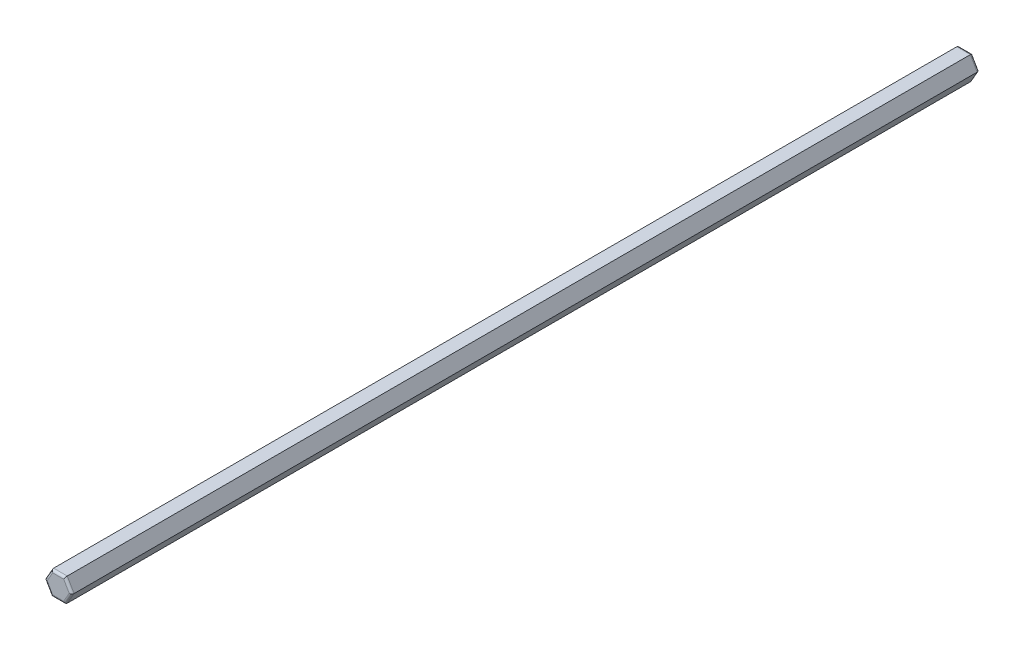
ISO-10303-21;
HEADER;
FILE_DESCRIPTION(('STEP AP214'),'2;1');
FILE_NAME('part.step','',(''),(''),'','','');
FILE_SCHEMA(('AUTOMOTIVE_DESIGN { 1 0 10303 214 1 1 1 1 }'));
ENDSEC;
DATA;
#1=APPLICATION_CONTEXT('core data for automotive mechanical design processes');
#2=APPLICATION_PROTOCOL_DEFINITION('international standard','automotive_design',2000,#1);
#3=PRODUCT_CONTEXT('',#1,'mechanical');
#4=PRODUCT('Part','Part','',(#3));
#5=PRODUCT_RELATED_PRODUCT_CATEGORY('part','',(#4));
#6=PRODUCT_DEFINITION_FORMATION('','',#4);
#7=PRODUCT_DEFINITION_CONTEXT('part definition',#1,'design');
#8=PRODUCT_DEFINITION('design','',#6,#7);
#9=PRODUCT_DEFINITION_SHAPE('','',#8);
#10=(LENGTH_UNIT() NAMED_UNIT(*) SI_UNIT(.MILLI.,.METRE.));
#11=(NAMED_UNIT(*) PLANE_ANGLE_UNIT() SI_UNIT($,.RADIAN.));
#12=(NAMED_UNIT(*) SI_UNIT($,.STERADIAN.) SOLID_ANGLE_UNIT());
#13=UNCERTAINTY_MEASURE_WITH_UNIT(LENGTH_MEASURE(1.E-05),#10,'distance_accuracy_value','');
#14=(GEOMETRIC_REPRESENTATION_CONTEXT(3) GLOBAL_UNCERTAINTY_ASSIGNED_CONTEXT((#13)) GLOBAL_UNIT_ASSIGNED_CONTEXT((#10,
#11,#12)) REPRESENTATION_CONTEXT('',''));
#15=CARTESIAN_POINT('',(0.,0.,0.));
#16=DIRECTION('',(0.,0.,1.));
#17=DIRECTION('',(1.,0.,0.));
#18=AXIS2_PLACEMENT_3D('',#15,#16,#17);
#19=CARTESIAN_POINT('',(0.75,-1.29903810567666,0.));
#20=DIRECTION('',(0.,-1.,0.));
#21=DIRECTION('',(0.,0.,-1.));
#22=AXIS2_PLACEMENT_3D('',#19,#20,#21);
#23=PLANE('',#22);
#24=DIRECTION('',(0.,0.,-1.));
#25=VECTOR('',#24,1.);
#26=CARTESIAN_POINT('',(0.75,-1.29903810567666,0.));
#27=LINE('',#26,#25);
#28=CARTESIAN_POINT('',(0.75,-1.29903810567666,-0.25));
#29=VERTEX_POINT('',#28);
#30=CARTESIAN_POINT('',(0.75,-1.29903810567666,-99.75));
#31=VERTEX_POINT('',#30);
#32=EDGE_CURVE('E133',#29,#31,#27,.T.);
#33=ORIENTED_EDGE('',*,*,#32,.F.);
#34=DIRECTION('',(-1.,0.,0.));
#35=VECTOR('',#34,1.);
#36=CARTESIAN_POINT('',(-0.75,-1.29903810567666,-0.25));
#37=LINE('',#36,#35);
#38=CARTESIAN_POINT('',(-0.749999999999999,-1.29903810567666,-0.25));
#39=VERTEX_POINT('',#38);
#40=EDGE_CURVE('E128',#29,#39,#37,.T.);
#41=ORIENTED_EDGE('',*,*,#40,.T.);
#42=DIRECTION('',(0.,0.,-1.));
#43=VECTOR('',#42,1.);
#44=CARTESIAN_POINT('',(-0.749999999999999,-1.29903810567666,0.));
#45=LINE('',#44,#43);
#46=CARTESIAN_POINT('',(-0.749999999999999,-1.29903810567666,-99.75));
#47=VERTEX_POINT('',#46);
#48=EDGE_CURVE('E130',#39,#47,#45,.T.);
#49=ORIENTED_EDGE('',*,*,#48,.T.);
#50=DIRECTION('',(-1.,0.,0.));
#51=VECTOR('',#50,1.);
#52=CARTESIAN_POINT('',(0.75,-1.29903810567666,-99.75));
#53=LINE('',#52,#51);
#54=EDGE_CURVE('E139',#47,#31,#53,.F.);
#55=ORIENTED_EDGE('',*,*,#54,.T.);
#56=EDGE_LOOP('',(#33,#41,#49,#55));
#57=FACE_BOUND('',#56,.T.);
#58=ADVANCED_FACE('F34',(#57),#23,.T.);
#59=CARTESIAN_POINT('',(1.5,0.,0.));
#60=DIRECTION('',(0.866025403784439,-0.5,0.));
#61=DIRECTION('',(0.5,0.866025403784439,0.));
#62=AXIS2_PLACEMENT_3D('',#59,#60,#61);
#63=PLANE('',#62);
#64=DIRECTION('',(0.,0.,-1.));
#65=VECTOR('',#64,1.);
#66=CARTESIAN_POINT('',(1.5,0.,0.));
#67=LINE('',#66,#65);
#68=CARTESIAN_POINT('',(1.5,0.,-0.25));
#69=VERTEX_POINT('',#68);
#70=CARTESIAN_POINT('',(1.5,0.,-99.75));
#71=VERTEX_POINT('',#70);
#72=EDGE_CURVE('E245',#69,#71,#67,.T.);
#73=ORIENTED_EDGE('',*,*,#72,.F.);
#74=DIRECTION('',(-0.5,-0.866025403784439,0.));
#75=VECTOR('',#74,1.);
#76=CARTESIAN_POINT('',(0.75,-1.29903810567666,-0.25));
#77=LINE('',#76,#75);
#78=EDGE_CURVE('E190',#69,#29,#77,.T.);
#79=ORIENTED_EDGE('',*,*,#78,.T.);
#80=ORIENTED_EDGE('',*,*,#32,.T.);
#81=DIRECTION('',(-0.5,-0.866025403784439,0.));
#82=VECTOR('',#81,1.);
#83=CARTESIAN_POINT('',(1.5,0.,-99.75));
#84=LINE('',#83,#82);
#85=EDGE_CURVE('E188',#31,#71,#84,.F.);
#86=ORIENTED_EDGE('',*,*,#85,.T.);
#87=EDGE_LOOP('',(#73,#79,#80,#86));
#88=FACE_BOUND('',#87,.T.);
#89=ADVANCED_FACE('F242',(#88),#63,.T.);
#90=CARTESIAN_POINT('',(0.749999999999999,1.29903810567666,0.));
#91=DIRECTION('',(0.866025403784439,0.5,0.));
#92=DIRECTION('',(-0.5,0.866025403784439,0.));
#93=AXIS2_PLACEMENT_3D('',#90,#91,#92);
#94=PLANE('',#93);
#95=DIRECTION('',(0.,0.,-1.));
#96=VECTOR('',#95,1.);
#97=CARTESIAN_POINT('',(0.749999999999999,1.29903810567666,0.));
#98=LINE('',#97,#96);
#99=CARTESIAN_POINT('',(0.749999999999999,1.29903810567666,-0.25));
#100=VERTEX_POINT('',#99);
#101=CARTESIAN_POINT('',(0.749999999999999,1.29903810567666,-99.75));
#102=VERTEX_POINT('',#101);
#103=EDGE_CURVE('E247',#100,#102,#98,.T.);
#104=ORIENTED_EDGE('',*,*,#103,.F.);
#105=DIRECTION('',(0.5,-0.866025403784439,0.));
#106=VECTOR('',#105,1.);
#107=CARTESIAN_POINT('',(1.5,0.,-0.25));
#108=LINE('',#107,#106);
#109=EDGE_CURVE('E195',#100,#69,#108,.T.);
#110=ORIENTED_EDGE('',*,*,#109,.T.);
#111=ORIENTED_EDGE('',*,*,#72,.T.);
#112=DIRECTION('',(0.5,-0.866025403784439,0.));
#113=VECTOR('',#112,1.);
#114=CARTESIAN_POINT('',(0.749999999999999,1.29903810567666,-99.75));
#115=LINE('',#114,#113);
#116=EDGE_CURVE('E192',#71,#102,#115,.F.);
#117=ORIENTED_EDGE('',*,*,#116,.T.);
#118=EDGE_LOOP('',(#104,#110,#111,#117));
#119=FACE_BOUND('',#118,.T.);
#120=ADVANCED_FACE('F280',(#119),#94,.T.);
#121=CARTESIAN_POINT('',(-0.75,1.29903810567666,0.));
#122=DIRECTION('',(0.,1.,0.));
#123=DIRECTION('',(0.,0.,1.));
#124=AXIS2_PLACEMENT_3D('',#121,#122,#123);
#125=PLANE('',#124);
#126=DIRECTION('',(0.,0.,-1.));
#127=VECTOR('',#126,1.);
#128=CARTESIAN_POINT('',(-0.75,1.29903810567666,0.));
#129=LINE('',#128,#127);
#130=CARTESIAN_POINT('',(-0.75,1.29903810567666,-0.25));
#131=VERTEX_POINT('',#130);
#132=CARTESIAN_POINT('',(-0.75,1.29903810567666,-99.75));
#133=VERTEX_POINT('',#132);
#134=EDGE_CURVE('E252',#131,#133,#129,.T.);
#135=ORIENTED_EDGE('',*,*,#134,.F.);
#136=DIRECTION('',(1.,0.,0.));
#137=VECTOR('',#136,1.);
#138=CARTESIAN_POINT('',(0.749999999999999,1.29903810567666,-0.25));
#139=LINE('',#138,#137);
#140=EDGE_CURVE('E186',#131,#100,#139,.T.);
#141=ORIENTED_EDGE('',*,*,#140,.T.);
#142=ORIENTED_EDGE('',*,*,#103,.T.);
#143=DIRECTION('',(1.,0.,0.));
#144=VECTOR('',#143,1.);
#145=CARTESIAN_POINT('',(-0.75,1.29903810567666,-99.75));
#146=LINE('',#145,#144);
#147=EDGE_CURVE('E138',#102,#133,#146,.F.);
#148=ORIENTED_EDGE('',*,*,#147,.T.);
#149=EDGE_LOOP('',(#135,#141,#142,#148));
#150=FACE_BOUND('',#149,.T.);
#151=ADVANCED_FACE('F260',(#150),#125,.T.);
#152=CARTESIAN_POINT('',(-1.5,0.,0.));
#153=DIRECTION('',(-0.866025403784439,0.5,0.));
#154=DIRECTION('',(-0.5,-0.866025403784439,0.));
#155=AXIS2_PLACEMENT_3D('',#152,#153,#154);
#156=PLANE('',#155);
#157=DIRECTION('',(0.,0.,-1.));
#158=VECTOR('',#157,1.);
#159=CARTESIAN_POINT('',(-1.5,0.,0.));
#160=LINE('',#159,#158);
#161=CARTESIAN_POINT('',(-1.5,0.,-0.25));
#162=VERTEX_POINT('',#161);
#163=CARTESIAN_POINT('',(-1.5,0.,-99.75));
#164=VERTEX_POINT('',#163);
#165=EDGE_CURVE('E150',#162,#164,#160,.T.);
#166=ORIENTED_EDGE('',*,*,#165,.F.);
#167=DIRECTION('',(0.5,0.866025403784439,0.));
#168=VECTOR('',#167,1.);
#169=CARTESIAN_POINT('',(-0.75,1.29903810567666,-0.25));
#170=LINE('',#169,#168);
#171=EDGE_CURVE('E182',#162,#131,#170,.T.);
#172=ORIENTED_EDGE('',*,*,#171,.T.);
#173=ORIENTED_EDGE('',*,*,#134,.T.);
#174=DIRECTION('',(0.5,0.866025403784439,0.));
#175=VECTOR('',#174,1.);
#176=CARTESIAN_POINT('',(-1.5,0.,-99.75));
#177=LINE('',#176,#175);
#178=EDGE_CURVE('E180',#133,#164,#177,.F.);
#179=ORIENTED_EDGE('',*,*,#178,.T.);
#180=EDGE_LOOP('',(#166,#172,#173,#179));
#181=FACE_BOUND('',#180,.T.);
#182=ADVANCED_FACE('F256',(#181),#156,.T.);
#183=CARTESIAN_POINT('',(-0.749999999999999,-1.29903810567666,0.));
#184=DIRECTION('',(-0.866025403784438,-0.5,0.));
#185=DIRECTION('',(0.5,-0.866025403784439,0.));
#186=AXIS2_PLACEMENT_3D('',#183,#184,#185);
#187=PLANE('',#186);
#188=ORIENTED_EDGE('',*,*,#48,.F.);
#189=DIRECTION('',(-0.5,0.866025403784439,0.));
#190=VECTOR('',#189,1.);
#191=CARTESIAN_POINT('',(-1.5,0.,-0.25));
#192=LINE('',#191,#190);
#193=EDGE_CURVE('E146',#39,#162,#192,.T.);
#194=ORIENTED_EDGE('',*,*,#193,.T.);
#195=ORIENTED_EDGE('',*,*,#165,.T.);
#196=DIRECTION('',(-0.5,0.866025403784439,0.));
#197=VECTOR('',#196,1.);
#198=CARTESIAN_POINT('',(-0.749999999999999,-1.29903810567666,-99.75));
#199=LINE('',#198,#197);
#200=EDGE_CURVE('E149',#164,#47,#199,.F.);
#201=ORIENTED_EDGE('',*,*,#200,.T.);
#202=EDGE_LOOP('',(#188,#194,#195,#201));
#203=FACE_BOUND('',#202,.T.);
#204=ADVANCED_FACE('F143',(#203),#187,.T.);
#205=CARTESIAN_POINT('',(0.,0.,0.));
#206=DIRECTION('',(0.,0.,-1.));
#207=DIRECTION('',(-1.,0.,0.));
#208=AXIS2_PLACEMENT_3D('',#205,#206,#207);
#209=PLANE('',#208);
#210=DIRECTION('',(0.5,0.866025403784439,0.));
#211=VECTOR('',#210,1.);
#212=CARTESIAN_POINT('',(-1.28349364905389,-0.124999999999999,0.));
#213=LINE('',#212,#211);
#214=CARTESIAN_POINT('',(-0.605662432702594,1.04903810567666,0.));
#215=VERTEX_POINT('',#214);
#216=CARTESIAN_POINT('',(-1.21132486540519,0.,0.));
#217=VERTEX_POINT('',#216);
#218=EDGE_CURVE('E176',#215,#217,#213,.F.);
#219=ORIENTED_EDGE('',*,*,#218,.T.);
#220=DIRECTION('',(-0.5,0.866025403784439,0.));
#221=VECTOR('',#220,1.);
#222=CARTESIAN_POINT('',(-0.53349364905389,-1.17403810567666,0.));
#223=LINE('',#222,#221);
#224=CARTESIAN_POINT('',(-0.605662432702593,-1.04903810567666,0.));
#225=VERTEX_POINT('',#224);
#226=EDGE_CURVE('E178',#217,#225,#223,.F.);
#227=ORIENTED_EDGE('',*,*,#226,.T.);
#228=DIRECTION('',(-1.,0.,0.));
#229=VECTOR('',#228,1.);
#230=CARTESIAN_POINT('',(0.75,-1.04903810567666,0.));
#231=LINE('',#230,#229);
#232=CARTESIAN_POINT('',(0.605662432702594,-1.04903810567666,0.));
#233=VERTEX_POINT('',#232);
#234=EDGE_CURVE('E156',#225,#233,#231,.F.);
#235=ORIENTED_EDGE('',*,*,#234,.T.);
#236=DIRECTION('',(-0.5,-0.866025403784439,0.));
#237=VECTOR('',#236,1.);
#238=CARTESIAN_POINT('',(1.28349364905389,0.125,0.));
#239=LINE('',#238,#237);
#240=CARTESIAN_POINT('',(1.21132486540519,0.,0.));
#241=VERTEX_POINT('',#240);
#242=EDGE_CURVE('E168',#233,#241,#239,.F.);
#243=ORIENTED_EDGE('',*,*,#242,.T.);
#244=DIRECTION('',(0.5,-0.866025403784439,0.));
#245=VECTOR('',#244,1.);
#246=CARTESIAN_POINT('',(0.533493649053889,1.17403810567666,0.));
#247=LINE('',#246,#245);
#248=CARTESIAN_POINT('',(0.605662432702593,1.04903810567666,0.));
#249=VERTEX_POINT('',#248);
#250=EDGE_CURVE('E166',#241,#249,#247,.F.);
#251=ORIENTED_EDGE('',*,*,#250,.T.);
#252=DIRECTION('',(1.,0.,0.));
#253=VECTOR('',#252,1.);
#254=CARTESIAN_POINT('',(-0.75,1.04903810567666,0.));
#255=LINE('',#254,#253);
#256=EDGE_CURVE('E173',#249,#215,#255,.F.);
#257=ORIENTED_EDGE('',*,*,#256,.T.);
#258=EDGE_LOOP('',(#219,#227,#235,#243,#251,#257));
#259=FACE_BOUND('',#258,.T.);
#260=ADVANCED_FACE('F272',(#259),#209,.F.);
#261=CARTESIAN_POINT('',(0.,0.,-100.));
#262=DIRECTION('',(0.,0.,-1.));
#263=DIRECTION('',(-1.,0.,0.));
#264=AXIS2_PLACEMENT_3D('',#261,#262,#263);
#265=PLANE('',#264);
#266=DIRECTION('',(1.,0.,0.));
#267=VECTOR('',#266,1.);
#268=CARTESIAN_POINT('',(0.,1.04903810567666,-100.));
#269=LINE('',#268,#267);
#270=CARTESIAN_POINT('',(-0.605662432702594,1.04903810567666,-100.));
#271=VERTEX_POINT('',#270);
#272=CARTESIAN_POINT('',(0.605662432702593,1.04903810567666,-100.));
#273=VERTEX_POINT('',#272);
#274=EDGE_CURVE('E58',#271,#273,#269,.T.);
#275=ORIENTED_EDGE('',*,*,#274,.T.);
#276=DIRECTION('',(0.5,-0.866025403784439,0.));
#277=VECTOR('',#276,1.);
#278=CARTESIAN_POINT('',(0.90849364905389,0.524519052838329,-100.));
#279=LINE('',#278,#277);
#280=CARTESIAN_POINT('',(1.21132486540519,0.,-100.));
#281=VERTEX_POINT('',#280);
#282=EDGE_CURVE('E11',#273,#281,#279,.T.);
#283=ORIENTED_EDGE('',*,*,#282,.T.);
#284=DIRECTION('',(-0.5,-0.866025403784439,0.));
#285=VECTOR('',#284,1.);
#286=CARTESIAN_POINT('',(0.908493649053891,-0.524519052838329,-100.));
#287=LINE('',#286,#285);
#288=CARTESIAN_POINT('',(0.605662432702594,-1.04903810567666,-100.));
#289=VERTEX_POINT('',#288);
#290=EDGE_CURVE('E43',#281,#289,#287,.T.);
#291=ORIENTED_EDGE('',*,*,#290,.T.);
#292=DIRECTION('',(-1.,0.,0.));
#293=VECTOR('',#292,1.);
#294=CARTESIAN_POINT('',(0.,-1.04903810567666,-100.));
#295=LINE('',#294,#293);
#296=CARTESIAN_POINT('',(-0.605662432702593,-1.04903810567666,-100.));
#297=VERTEX_POINT('',#296);
#298=EDGE_CURVE('E201',#289,#297,#295,.T.);
#299=ORIENTED_EDGE('',*,*,#298,.T.);
#300=DIRECTION('',(-0.5,0.866025403784439,0.));
#301=VECTOR('',#300,1.);
#302=CARTESIAN_POINT('',(-0.90849364905389,-0.524519052838329,-100.));
#303=LINE('',#302,#301);
#304=CARTESIAN_POINT('',(-1.21132486540519,0.,-100.));
#305=VERTEX_POINT('',#304);
#306=EDGE_CURVE('E197',#297,#305,#303,.T.);
#307=ORIENTED_EDGE('',*,*,#306,.T.);
#308=DIRECTION('',(0.5,0.866025403784439,0.));
#309=VECTOR('',#308,1.);
#310=CARTESIAN_POINT('',(-0.908493649053891,0.524519052838329,-100.));
#311=LINE('',#310,#309);
#312=EDGE_CURVE('E199',#305,#271,#311,.T.);
#313=ORIENTED_EDGE('',*,*,#312,.T.);
#314=EDGE_LOOP('',(#275,#283,#291,#299,#307,#313));
#315=FACE_BOUND('',#314,.T.);
#316=ADVANCED_FACE('F284',(#315),#265,.T.);
#317=CARTESIAN_POINT('',(0.533493649053889,1.17403810567666,-0.25));
#318=DIRECTION('',(-0.5,0.866025403784439,0.));
#319=DIRECTION('',(-0.866025403784439,-0.5,0.));
#320=AXIS2_PLACEMENT_3D('',#317,#318,#319);
#321=CYLINDRICAL_SURFACE('',#320,0.25);
#322=CARTESIAN_POINT('',(0.605662432702593,1.04903810567666,-0.25));
#323=DIRECTION('',(-0.866025403784439,0.5,0.));
#324=DIRECTION('',(0.5,0.866025403784439,0.));
#325=AXIS2_PLACEMENT_3D('',#322,#323,#324);
#326=ELLIPSE('',#325,0.288675134594813,0.25);
#327=EDGE_CURVE('E210',#249,#100,#326,.T.);
#328=ORIENTED_EDGE('',*,*,#327,.F.);
#329=ORIENTED_EDGE('',*,*,#250,.F.);
#330=CARTESIAN_POINT('',(1.21132486540519,0.,-0.25));
#331=DIRECTION('',(0.,1.,0.));
#332=DIRECTION('',(-1.,0.,0.));
#333=AXIS2_PLACEMENT_3D('',#330,#331,#332);
#334=ELLIPSE('',#333,0.288675134594813,0.25);
#335=EDGE_CURVE('E151',#69,#241,#334,.F.);
#336=ORIENTED_EDGE('',*,*,#335,.F.);
#337=ORIENTED_EDGE('',*,*,#109,.F.);
#338=EDGE_LOOP('',(#328,#329,#336,#337));
#339=FACE_BOUND('',#338,.T.);
#340=ADVANCED_FACE('F278',(#339),#321,.T.);
#341=CARTESIAN_POINT('',(1.28349364905389,0.125,-0.25));
#342=DIRECTION('',(0.5,0.866025403784439,0.));
#343=DIRECTION('',(-0.866025403784439,0.5,0.));
#344=AXIS2_PLACEMENT_3D('',#341,#342,#343);
#345=CYLINDRICAL_SURFACE('',#344,0.25);
#346=ORIENTED_EDGE('',*,*,#335,.T.);
#347=ORIENTED_EDGE('',*,*,#242,.F.);
#348=CARTESIAN_POINT('',(0.605662432702594,-1.04903810567666,-0.25));
#349=DIRECTION('',(0.866025403784439,0.5,0.));
#350=DIRECTION('',(-0.5,0.866025403784439,0.));
#351=AXIS2_PLACEMENT_3D('',#348,#349,#350);
#352=ELLIPSE('',#351,0.288675134594813,0.25);
#353=EDGE_CURVE('E208',#29,#233,#352,.F.);
#354=ORIENTED_EDGE('',*,*,#353,.F.);
#355=ORIENTED_EDGE('',*,*,#78,.F.);
#356=EDGE_LOOP('',(#346,#347,#354,#355));
#357=FACE_BOUND('',#356,.T.);
#358=ADVANCED_FACE('F291',(#357),#345,.T.);
#359=CARTESIAN_POINT('',(-0.75,1.04903810567666,-0.25));
#360=DIRECTION('',(-1.,0.,0.));
#361=DIRECTION('',(0.,0.,1.));
#362=AXIS2_PLACEMENT_3D('',#359,#360,#361);
#363=CYLINDRICAL_SURFACE('',#362,0.25);
#364=ORIENTED_EDGE('',*,*,#327,.T.);
#365=ORIENTED_EDGE('',*,*,#140,.F.);
#366=CARTESIAN_POINT('',(-0.605662432702593,1.04903810567666,-0.25));
#367=DIRECTION('',(-0.866025403784439,-0.5,0.));
#368=DIRECTION('',(-0.5,0.866025403784439,0.));
#369=AXIS2_PLACEMENT_3D('',#366,#367,#368);
#370=ELLIPSE('',#369,0.288675134594813,0.25);
#371=EDGE_CURVE('E160',#215,#131,#370,.T.);
#372=ORIENTED_EDGE('',*,*,#371,.F.);
#373=ORIENTED_EDGE('',*,*,#256,.F.);
#374=EDGE_LOOP('',(#364,#365,#372,#373));
#375=FACE_BOUND('',#374,.T.);
#376=ADVANCED_FACE('F265',(#375),#363,.T.);
#377=CARTESIAN_POINT('',(0.75,-1.04903810567666,-0.25));
#378=DIRECTION('',(1.,0.,0.));
#379=DIRECTION('',(0.,0.,-1.));
#380=AXIS2_PLACEMENT_3D('',#377,#378,#379);
#381=CYLINDRICAL_SURFACE('',#380,0.25);
#382=ORIENTED_EDGE('',*,*,#353,.T.);
#383=ORIENTED_EDGE('',*,*,#234,.F.);
#384=CARTESIAN_POINT('',(-0.605662432702593,-1.04903810567666,-0.25));
#385=DIRECTION('',(0.866025403784439,-0.5,0.));
#386=DIRECTION('',(0.5,0.866025403784439,0.));
#387=AXIS2_PLACEMENT_3D('',#384,#385,#386);
#388=ELLIPSE('',#387,0.288675134594813,0.25);
#389=EDGE_CURVE('E154',#39,#225,#388,.F.);
#390=ORIENTED_EDGE('',*,*,#389,.F.);
#391=ORIENTED_EDGE('',*,*,#40,.F.);
#392=EDGE_LOOP('',(#382,#383,#390,#391));
#393=FACE_BOUND('',#392,.T.);
#394=ADVANCED_FACE('F155',(#393),#381,.T.);
#395=CARTESIAN_POINT('',(-1.28349364905389,-0.124999999999999,-0.25));
#396=DIRECTION('',(-0.5,-0.866025403784439,0.));
#397=DIRECTION('',(0.866025403784439,-0.5,0.));
#398=AXIS2_PLACEMENT_3D('',#395,#396,#397);
#399=CYLINDRICAL_SURFACE('',#398,0.25);
#400=ORIENTED_EDGE('',*,*,#371,.T.);
#401=ORIENTED_EDGE('',*,*,#171,.F.);
#402=CARTESIAN_POINT('',(-1.21132486540519,0.,-0.25));
#403=DIRECTION('',(0.,-1.,0.));
#404=DIRECTION('',(-1.,0.,0.));
#405=AXIS2_PLACEMENT_3D('',#402,#403,#404);
#406=ELLIPSE('',#405,0.288675134594813,0.25);
#407=EDGE_CURVE('E161',#217,#162,#406,.T.);
#408=ORIENTED_EDGE('',*,*,#407,.F.);
#409=ORIENTED_EDGE('',*,*,#218,.F.);
#410=EDGE_LOOP('',(#400,#401,#408,#409));
#411=FACE_BOUND('',#410,.T.);
#412=ADVANCED_FACE('F270',(#411),#399,.T.);
#413=CARTESIAN_POINT('',(-0.53349364905389,-1.17403810567666,-0.25));
#414=DIRECTION('',(0.5,-0.866025403784439,0.));
#415=DIRECTION('',(0.866025403784438,0.5,0.));
#416=AXIS2_PLACEMENT_3D('',#413,#414,#415);
#417=CYLINDRICAL_SURFACE('',#416,0.25);
#418=ORIENTED_EDGE('',*,*,#389,.T.);
#419=ORIENTED_EDGE('',*,*,#226,.F.);
#420=ORIENTED_EDGE('',*,*,#407,.T.);
#421=ORIENTED_EDGE('',*,*,#193,.F.);
#422=EDGE_LOOP('',(#418,#419,#420,#421));
#423=FACE_BOUND('',#422,.T.);
#424=ADVANCED_FACE('F163',(#423),#417,.T.);
#425=CARTESIAN_POINT('',(-0.90849364905389,-0.524519052838329,-99.75));
#426=DIRECTION('',(-0.5,0.866025403784439,0.));
#427=DIRECTION('',(-0.866025403784438,-0.5,0.));
#428=AXIS2_PLACEMENT_3D('',#425,#426,#427);
#429=CYLINDRICAL_SURFACE('',#428,0.25);
#430=CARTESIAN_POINT('',(-0.605662432702593,-1.04903810567666,-99.75));
#431=DIRECTION('',(-0.866025403784439,0.5,0.));
#432=DIRECTION('',(0.5,0.866025403784439,0.));
#433=AXIS2_PLACEMENT_3D('',#430,#431,#432);
#434=ELLIPSE('',#433,0.288675134594813,0.25);
#435=EDGE_CURVE('E223',#47,#297,#434,.F.);
#436=ORIENTED_EDGE('',*,*,#435,.F.);
#437=ORIENTED_EDGE('',*,*,#200,.F.);
#438=CARTESIAN_POINT('',(-1.21132486540519,0.,-99.75));
#439=DIRECTION('',(0.,1.,0.));
#440=DIRECTION('',(-1.,0.,0.));
#441=AXIS2_PLACEMENT_3D('',#438,#439,#440);
#442=ELLIPSE('',#441,0.288675134594813,0.25);
#443=EDGE_CURVE('E38',#305,#164,#442,.T.);
#444=ORIENTED_EDGE('',*,*,#443,.F.);
#445=ORIENTED_EDGE('',*,*,#306,.F.);
#446=EDGE_LOOP('',(#436,#437,#444,#445));
#447=FACE_BOUND('',#446,.T.);
#448=ADVANCED_FACE('F36',(#447),#429,.T.);
#449=CARTESIAN_POINT('',(-0.908493649053891,0.524519052838329,-99.75));
#450=DIRECTION('',(0.5,0.866025403784439,0.));
#451=DIRECTION('',(-0.866025403784439,0.5,0.));
#452=AXIS2_PLACEMENT_3D('',#449,#450,#451);
#453=CYLINDRICAL_SURFACE('',#452,0.25);
#454=ORIENTED_EDGE('',*,*,#443,.T.);
#455=ORIENTED_EDGE('',*,*,#178,.F.);
#456=CARTESIAN_POINT('',(-0.605662432702594,1.04903810567666,-99.75));
#457=DIRECTION('',(0.866025403784439,0.5,0.));
#458=DIRECTION('',(-0.5,0.866025403784439,0.));
#459=AXIS2_PLACEMENT_3D('',#456,#457,#458);
#460=ELLIPSE('',#459,0.288675134594813,0.25);
#461=EDGE_CURVE('E221',#271,#133,#460,.T.);
#462=ORIENTED_EDGE('',*,*,#461,.F.);
#463=ORIENTED_EDGE('',*,*,#312,.F.);
#464=EDGE_LOOP('',(#454,#455,#462,#463));
#465=FACE_BOUND('',#464,.T.);
#466=ADVANCED_FACE('F233',(#465),#453,.T.);
#467=CARTESIAN_POINT('',(0.,-1.04903810567666,-99.75));
#468=DIRECTION('',(-1.,0.,0.));
#469=DIRECTION('',(0.,0.,1.));
#470=AXIS2_PLACEMENT_3D('',#467,#468,#469);
#471=CYLINDRICAL_SURFACE('',#470,0.25);
#472=ORIENTED_EDGE('',*,*,#435,.T.);
#473=ORIENTED_EDGE('',*,*,#298,.F.);
#474=CARTESIAN_POINT('',(0.605662432702594,-1.04903810567666,-99.75));
#475=DIRECTION('',(-0.866025403784439,-0.5,0.));
#476=DIRECTION('',(-0.5,0.866025403784439,0.));
#477=AXIS2_PLACEMENT_3D('',#474,#475,#476);
#478=ELLIPSE('',#477,0.288675134594813,0.25);
#479=EDGE_CURVE('E218',#31,#289,#478,.F.);
#480=ORIENTED_EDGE('',*,*,#479,.F.);
#481=ORIENTED_EDGE('',*,*,#54,.F.);
#482=EDGE_LOOP('',(#472,#473,#480,#481));
#483=FACE_BOUND('',#482,.T.);
#484=ADVANCED_FACE('F238',(#483),#471,.T.);
#485=CARTESIAN_POINT('',(0.,1.04903810567666,-99.75));
#486=DIRECTION('',(1.,0.,0.));
#487=DIRECTION('',(0.,0.,-1.));
#488=AXIS2_PLACEMENT_3D('',#485,#486,#487);
#489=CYLINDRICAL_SURFACE('',#488,0.25);
#490=ORIENTED_EDGE('',*,*,#461,.T.);
#491=ORIENTED_EDGE('',*,*,#147,.F.);
#492=CARTESIAN_POINT('',(0.605662432702592,1.04903810567666,-99.75));
#493=DIRECTION('',(0.866025403784439,-0.5,0.));
#494=DIRECTION('',(0.5,0.866025403784439,0.));
#495=AXIS2_PLACEMENT_3D('',#492,#493,#494);
#496=ELLIPSE('',#495,0.288675134594813,0.25);
#497=EDGE_CURVE('E216',#273,#102,#496,.T.);
#498=ORIENTED_EDGE('',*,*,#497,.F.);
#499=ORIENTED_EDGE('',*,*,#274,.F.);
#500=EDGE_LOOP('',(#490,#491,#498,#499));
#501=FACE_BOUND('',#500,.T.);
#502=ADVANCED_FACE('F318',(#501),#489,.T.);
#503=CARTESIAN_POINT('',(0.908493649053891,-0.524519052838329,-99.75));
#504=DIRECTION('',(-0.5,-0.866025403784439,0.));
#505=DIRECTION('',(0.866025403784439,-0.5,0.));
#506=AXIS2_PLACEMENT_3D('',#503,#504,#505);
#507=CYLINDRICAL_SURFACE('',#506,0.25);
#508=ORIENTED_EDGE('',*,*,#479,.T.);
#509=ORIENTED_EDGE('',*,*,#290,.F.);
#510=CARTESIAN_POINT('',(1.21132486540519,0.,-99.75));
#511=DIRECTION('',(0.,-1.,0.));
#512=DIRECTION('',(-1.,0.,0.));
#513=AXIS2_PLACEMENT_3D('',#510,#511,#512);
#514=ELLIPSE('',#513,0.288675134594813,0.25);
#515=EDGE_CURVE('E51',#71,#281,#514,.F.);
#516=ORIENTED_EDGE('',*,*,#515,.F.);
#517=ORIENTED_EDGE('',*,*,#85,.F.);
#518=EDGE_LOOP('',(#508,#509,#516,#517));
#519=FACE_BOUND('',#518,.T.);
#520=ADVANCED_FACE('F283',(#519),#507,.T.);
#521=CARTESIAN_POINT('',(0.908493649053891,0.524519052838329,-99.75));
#522=DIRECTION('',(0.5,-0.866025403784439,0.));
#523=DIRECTION('',(0.866025403784439,0.5,0.));
#524=AXIS2_PLACEMENT_3D('',#521,#522,#523);
#525=CYLINDRICAL_SURFACE('',#524,0.25);
#526=ORIENTED_EDGE('',*,*,#497,.T.);
#527=ORIENTED_EDGE('',*,*,#116,.F.);
#528=ORIENTED_EDGE('',*,*,#515,.T.);
#529=ORIENTED_EDGE('',*,*,#282,.F.);
#530=EDGE_LOOP('',(#526,#527,#528,#529));
#531=FACE_BOUND('',#530,.T.);
#532=ADVANCED_FACE('F281',(#531),#525,.T.);
#533=CLOSED_SHELL('',(#58,#89,#120,#151,#182,#204,#260,#316,#340,#358,#376,#394,#412,#424,#448,
#466,#484,#502,#520,#532));
#534=MANIFOLD_SOLID_BREP('B2',#533);
#535=ADVANCED_BREP_SHAPE_REPRESENTATION('',(#18,#534),#14);
#536=SHAPE_DEFINITION_REPRESENTATION(#9,#535);
ENDSEC;
END-ISO-10303-21;
